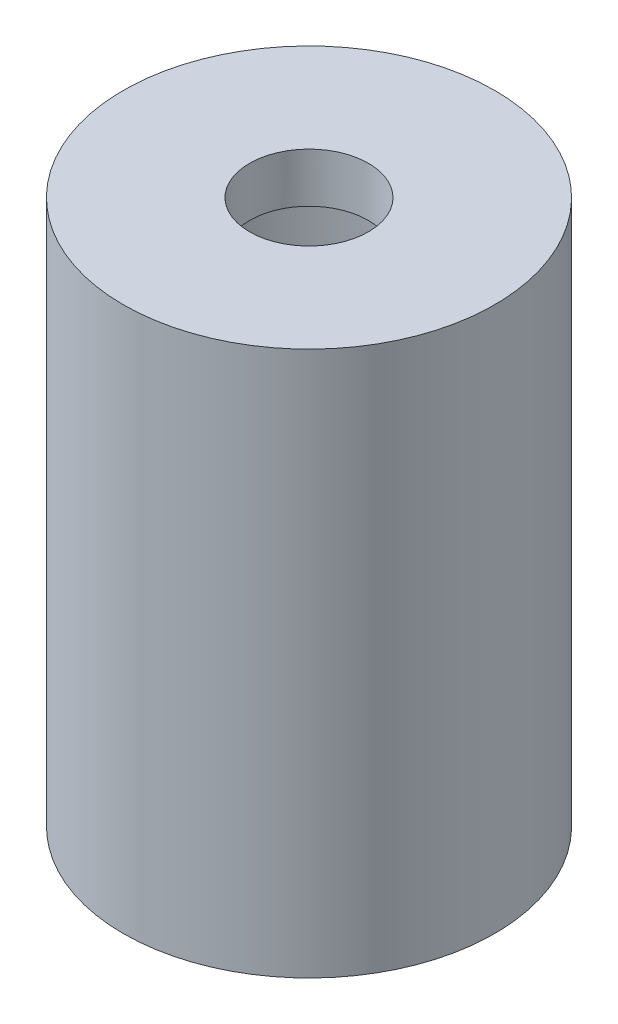
ISO-10303-21;
HEADER;
FILE_DESCRIPTION(('STEP AP214'),'2;1');
FILE_NAME('part.step','',(''),(''),'','','');
FILE_SCHEMA(('AUTOMOTIVE_DESIGN { 1 0 10303 214 1 1 1 1 }'));
ENDSEC;
DATA;
#1=APPLICATION_CONTEXT('core data for automotive mechanical design processes');
#2=APPLICATION_PROTOCOL_DEFINITION('international standard','automotive_design',2000,#1);
#3=PRODUCT_CONTEXT('',#1,'mechanical');
#4=PRODUCT('Part','Part','',(#3));
#5=PRODUCT_RELATED_PRODUCT_CATEGORY('part','',(#4));
#6=PRODUCT_DEFINITION_FORMATION('','',#4);
#7=PRODUCT_DEFINITION_CONTEXT('part definition',#1,'design');
#8=PRODUCT_DEFINITION('design','',#6,#7);
#9=PRODUCT_DEFINITION_SHAPE('','',#8);
#10=(LENGTH_UNIT() NAMED_UNIT(*) SI_UNIT(.MILLI.,.METRE.));
#11=(NAMED_UNIT(*) PLANE_ANGLE_UNIT() SI_UNIT($,.RADIAN.));
#12=(NAMED_UNIT(*) SI_UNIT($,.STERADIAN.) SOLID_ANGLE_UNIT());
#13=UNCERTAINTY_MEASURE_WITH_UNIT(LENGTH_MEASURE(1.E-05),#10,'distance_accuracy_value','');
#14=(GEOMETRIC_REPRESENTATION_CONTEXT(3) GLOBAL_UNCERTAINTY_ASSIGNED_CONTEXT((#13)) GLOBAL_UNIT_ASSIGNED_CONTEXT((#10,
#11,#12)) REPRESENTATION_CONTEXT('',''));
#15=CARTESIAN_POINT('',(0.,0.,0.));
#16=DIRECTION('',(0.,0.,1.));
#17=DIRECTION('',(1.,0.,0.));
#18=AXIS2_PLACEMENT_3D('',#15,#16,#17);
#19=CARTESIAN_POINT('',(37.5,0.,0.));
#20=DIRECTION('',(0.,-1.,0.));
#21=DIRECTION('',(0.,0.,-1.));
#22=AXIS2_PLACEMENT_3D('',#19,#20,#21);
#23=CYLINDRICAL_SURFACE('',#22,37.5);
#24=CARTESIAN_POINT('',(37.5,0.,0.));
#25=DIRECTION('',(0.,-1.,0.));
#26=DIRECTION('',(0.,0.,-1.));
#27=AXIS2_PLACEMENT_3D('',#24,#25,#26);
#28=CIRCLE('',#27,37.5);
#29=CARTESIAN_POINT('',(37.5,0.,-37.5));
#30=VERTEX_POINT('',#29);
#31=EDGE_CURVE('E38',#30,#30,#28,.T.);
#32=ORIENTED_EDGE('',*,*,#31,.F.);
#33=EDGE_LOOP('',(#32));
#34=FACE_BOUND('',#33,.T.);
#35=CARTESIAN_POINT('',(37.5,110.,0.));
#36=DIRECTION('',(0.,-1.,0.));
#37=DIRECTION('',(0.,0.,-1.));
#38=AXIS2_PLACEMENT_3D('',#35,#36,#37);
#39=CIRCLE('',#38,37.5);
#40=CARTESIAN_POINT('',(37.5,110.,-37.5));
#41=VERTEX_POINT('',#40);
#42=EDGE_CURVE('E10',#41,#41,#39,.T.);
#43=ORIENTED_EDGE('',*,*,#42,.T.);
#44=EDGE_LOOP('',(#43));
#45=FACE_BOUND('',#44,.T.);
#46=ADVANCED_FACE('F31',(#34,#45),#23,.T.);
#47=CARTESIAN_POINT('',(0.,110.,0.));
#48=DIRECTION('',(0.,-1.,0.));
#49=DIRECTION('',(0.,0.,-1.));
#50=AXIS2_PLACEMENT_3D('',#47,#48,#49);
#51=PLANE('',#50);
#52=CARTESIAN_POINT('',(37.5,110.,0.));
#53=DIRECTION('',(0.,1.,0.));
#54=DIRECTION('',(0.,0.,1.));
#55=AXIS2_PLACEMENT_3D('',#52,#53,#54);
#56=CIRCLE('',#55,12.);
#57=CARTESIAN_POINT('',(37.5,110.,12.));
#58=VERTEX_POINT('',#57);
#59=EDGE_CURVE('E50',#58,#58,#56,.T.);
#60=ORIENTED_EDGE('',*,*,#59,.F.);
#61=EDGE_LOOP('',(#60));
#62=FACE_BOUND('',#61,.T.);
#63=ORIENTED_EDGE('',*,*,#42,.F.);
#64=EDGE_LOOP('',(#63));
#65=FACE_BOUND('',#64,.T.);
#66=ADVANCED_FACE('F74',(#62,#65),#51,.F.);
#67=CARTESIAN_POINT('',(0.,0.,0.));
#68=DIRECTION('',(0.,1.,0.));
#69=DIRECTION('',(0.,0.,1.));
#70=AXIS2_PLACEMENT_3D('',#67,#68,#69);
#71=PLANE('',#70);
#72=CARTESIAN_POINT('',(37.5,0.,0.));
#73=DIRECTION('',(0.,-1.,0.));
#74=DIRECTION('',(0.,0.,-1.));
#75=AXIS2_PLACEMENT_3D('',#72,#73,#74);
#76=CIRCLE('',#75,35.);
#77=CARTESIAN_POINT('',(37.5,0.,-35.));
#78=VERTEX_POINT('',#77);
#79=EDGE_CURVE('E45',#78,#78,#76,.T.);
#80=ORIENTED_EDGE('',*,*,#79,.F.);
#81=EDGE_LOOP('',(#80));
#82=FACE_BOUND('',#81,.T.);
#83=ORIENTED_EDGE('',*,*,#31,.T.);
#84=EDGE_LOOP('',(#83));
#85=FACE_BOUND('',#84,.T.);
#86=ADVANCED_FACE('F68',(#82,#85),#71,.F.);
#87=CARTESIAN_POINT('',(37.5,100.,0.));
#88=DIRECTION('',(0.,-1.,0.));
#89=DIRECTION('',(0.,0.,-1.));
#90=AXIS2_PLACEMENT_3D('',#87,#88,#89);
#91=CYLINDRICAL_SURFACE('',#90,35.);
#92=CARTESIAN_POINT('',(37.5,100.,0.));
#93=DIRECTION('',(0.,-1.,0.));
#94=DIRECTION('',(0.,0.,-1.));
#95=AXIS2_PLACEMENT_3D('',#92,#93,#94);
#96=CIRCLE('',#95,35.);
#97=CARTESIAN_POINT('',(37.5,100.,-35.));
#98=VERTEX_POINT('',#97);
#99=EDGE_CURVE('E42',#98,#98,#96,.T.);
#100=ORIENTED_EDGE('',*,*,#99,.F.);
#101=EDGE_LOOP('',(#100));
#102=FACE_BOUND('',#101,.T.);
#103=ORIENTED_EDGE('',*,*,#79,.T.);
#104=EDGE_LOOP('',(#103));
#105=FACE_BOUND('',#104,.T.);
#106=ADVANCED_FACE('F62',(#102,#105),#91,.F.);
#107=CARTESIAN_POINT('',(0.,100.,0.));
#108=DIRECTION('',(0.,-1.,0.));
#109=DIRECTION('',(0.,0.,-1.));
#110=AXIS2_PLACEMENT_3D('',#107,#108,#109);
#111=PLANE('',#110);
#112=CARTESIAN_POINT('',(37.5,100.,0.));
#113=DIRECTION('',(0.,-1.,0.));
#114=DIRECTION('',(0.,0.,-1.));
#115=AXIS2_PLACEMENT_3D('',#112,#113,#114);
#116=CIRCLE('',#115,12.);
#117=CARTESIAN_POINT('',(37.5,100.,-12.));
#118=VERTEX_POINT('',#117);
#119=EDGE_CURVE('E34',#118,#118,#116,.T.);
#120=ORIENTED_EDGE('',*,*,#119,.F.);
#121=EDGE_LOOP('',(#120));
#122=FACE_BOUND('',#121,.T.);
#123=ORIENTED_EDGE('',*,*,#99,.T.);
#124=EDGE_LOOP('',(#123));
#125=FACE_BOUND('',#124,.T.);
#126=ADVANCED_FACE('F59',(#122,#125),#111,.T.);
#127=CARTESIAN_POINT('',(37.5,0.,0.));
#128=DIRECTION('',(0.,1.,0.));
#129=DIRECTION('',(0.,0.,1.));
#130=AXIS2_PLACEMENT_3D('',#127,#128,#129);
#131=CYLINDRICAL_SURFACE('',#130,12.);
#132=ORIENTED_EDGE('',*,*,#119,.T.);
#133=EDGE_LOOP('',(#132));
#134=FACE_BOUND('',#133,.T.);
#135=ORIENTED_EDGE('',*,*,#59,.T.);
#136=EDGE_LOOP('',(#135));
#137=FACE_BOUND('',#136,.T.);
#138=ADVANCED_FACE('F57',(#134,#137),#131,.F.);
#139=CLOSED_SHELL('',(#46,#66,#86,#106,#126,#138));
#140=MANIFOLD_SOLID_BREP('B2',#139);
#141=ADVANCED_BREP_SHAPE_REPRESENTATION('',(#18,#140),#14);
#142=SHAPE_DEFINITION_REPRESENTATION(#9,#141);
ENDSEC;
END-ISO-10303-21;
